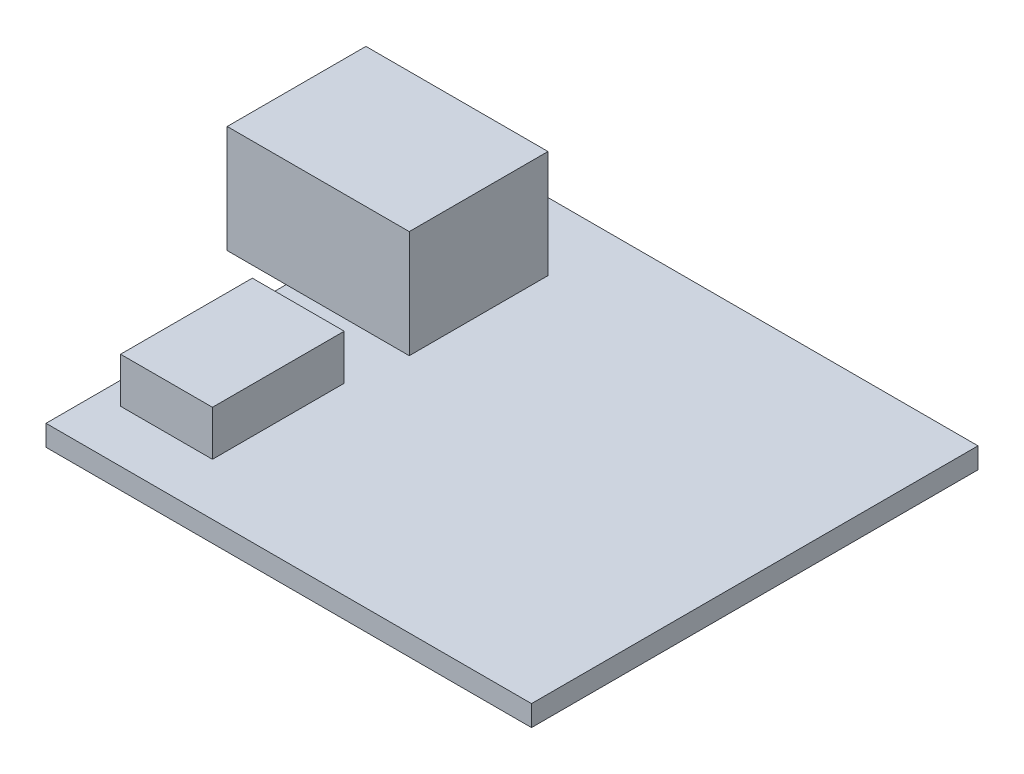
ISO-10303-21;
HEADER;
FILE_DESCRIPTION(('STEP AP214'),'2;1');
FILE_NAME('part.step','',(''),(''),'','','');
FILE_SCHEMA(('AUTOMOTIVE_DESIGN { 1 0 10303 214 1 1 1 1 }'));
ENDSEC;
DATA;
#1=APPLICATION_CONTEXT('core data for automotive mechanical design processes');
#2=APPLICATION_PROTOCOL_DEFINITION('international standard','automotive_design',2000,#1);
#3=PRODUCT_CONTEXT('',#1,'mechanical');
#4=PRODUCT('Part','Part','',(#3));
#5=PRODUCT_RELATED_PRODUCT_CATEGORY('part','',(#4));
#6=PRODUCT_DEFINITION_FORMATION('','',#4);
#7=PRODUCT_DEFINITION_CONTEXT('part definition',#1,'design');
#8=PRODUCT_DEFINITION('design','',#6,#7);
#9=PRODUCT_DEFINITION_SHAPE('','',#8);
#10=(LENGTH_UNIT() NAMED_UNIT(*) SI_UNIT(.MILLI.,.METRE.));
#11=(NAMED_UNIT(*) PLANE_ANGLE_UNIT() SI_UNIT($,.RADIAN.));
#12=(NAMED_UNIT(*) SI_UNIT($,.STERADIAN.) SOLID_ANGLE_UNIT());
#13=UNCERTAINTY_MEASURE_WITH_UNIT(LENGTH_MEASURE(1.E-05),#10,'distance_accuracy_value','');
#14=(GEOMETRIC_REPRESENTATION_CONTEXT(3) GLOBAL_UNCERTAINTY_ASSIGNED_CONTEXT((#13)) GLOBAL_UNIT_ASSIGNED_CONTEXT((#10,
#11,#12)) REPRESENTATION_CONTEXT('',''));
#15=CARTESIAN_POINT('',(0.,0.,0.));
#16=DIRECTION('',(0.,0.,1.));
#17=DIRECTION('',(1.,0.,0.));
#18=AXIS2_PLACEMENT_3D('',#15,#16,#17);
#19=CARTESIAN_POINT('',(0.,1.2,0.));
#20=DIRECTION('',(0.,-1.,0.));
#21=DIRECTION('',(0.,0.,-1.));
#22=AXIS2_PLACEMENT_3D('',#19,#20,#21);
#23=PLANE('',#22);
#24=DIRECTION('',(1.,0.,0.));
#25=VECTOR('',#24,1.);
#26=CARTESIAN_POINT('',(-6.9,1.2,-0.974999999999996));
#27=LINE('',#26,#25);
#28=CARTESIAN_POINT('',(-14.,1.2,-0.974999999999992));
#29=VERTEX_POINT('',#28);
#30=CARTESIAN_POINT('',(-6.9,1.2,-0.974999999999996));
#31=VERTEX_POINT('',#30);
#32=EDGE_CURVE('E11',#29,#31,#27,.T.);
#33=ORIENTED_EDGE('',*,*,#32,.F.);
#34=DIRECTION('',(0.,0.,1.));
#35=VECTOR('',#34,1.);
#36=CARTESIAN_POINT('',(-14.,1.2,12.875));
#37=LINE('',#36,#35);
#38=CARTESIAN_POINT('',(-14.,1.2,12.875));
#39=VERTEX_POINT('',#38);
#40=EDGE_CURVE('E194',#29,#39,#37,.T.);
#41=ORIENTED_EDGE('',*,*,#40,.T.);
#42=DIRECTION('',(1.,0.,0.));
#43=VECTOR('',#42,1.);
#44=CARTESIAN_POINT('',(-14.,1.2,12.875));
#45=LINE('',#44,#43);
#46=CARTESIAN_POINT('',(14.,1.2,12.875));
#47=VERTEX_POINT('',#46);
#48=EDGE_CURVE('E197',#39,#47,#45,.T.);
#49=ORIENTED_EDGE('',*,*,#48,.T.);
#50=DIRECTION('',(0.,0.,-1.));
#51=VECTOR('',#50,1.);
#52=CARTESIAN_POINT('',(14.,1.2,12.875));
#53=LINE('',#52,#51);
#54=CARTESIAN_POINT('',(14.,1.2,-12.875));
#55=VERTEX_POINT('',#54);
#56=EDGE_CURVE('E188',#47,#55,#53,.T.);
#57=ORIENTED_EDGE('',*,*,#56,.T.);
#58=DIRECTION('',(-1.,0.,0.));
#59=VECTOR('',#58,1.);
#60=CARTESIAN_POINT('',(-14.,1.2,-12.875));
#61=LINE('',#60,#59);
#62=CARTESIAN_POINT('',(-14.,1.2,-12.875));
#63=VERTEX_POINT('',#62);
#64=EDGE_CURVE('E191',#55,#63,#61,.T.);
#65=ORIENTED_EDGE('',*,*,#64,.T.);
#66=CARTESIAN_POINT('',(-14.,1.2,-8.97499999999999));
#67=VERTEX_POINT('',#66);
#68=EDGE_CURVE('E195',#63,#67,#37,.T.);
#69=ORIENTED_EDGE('',*,*,#68,.T.);
#70=DIRECTION('',(-1.,0.,0.));
#71=VECTOR('',#70,1.);
#72=CARTESIAN_POINT('',(-6.9,1.2,-8.975));
#73=LINE('',#72,#71);
#74=CARTESIAN_POINT('',(-6.9,1.2,-8.975));
#75=VERTEX_POINT('',#74);
#76=EDGE_CURVE('E170',#75,#67,#73,.T.);
#77=ORIENTED_EDGE('',*,*,#76,.F.);
#78=DIRECTION('',(0.,0.,-1.));
#79=VECTOR('',#78,1.);
#80=CARTESIAN_POINT('',(-6.9,1.2,-8.975));
#81=LINE('',#80,#79);
#82=EDGE_CURVE('E151',#31,#75,#81,.T.);
#83=ORIENTED_EDGE('',*,*,#82,.F.);
#84=EDGE_LOOP('',(#33,#41,#49,#57,#65,#69,#77,#83));
#85=FACE_BOUND('',#84,.T.);
#86=DIRECTION('',(0.,0.,-1.));
#87=VECTOR('',#86,1.);
#88=CARTESIAN_POINT('',(-7.4,1.2,2.275));
#89=LINE('',#88,#87);
#90=CARTESIAN_POINT('',(-7.4,1.2,9.875));
#91=VERTEX_POINT('',#90);
#92=CARTESIAN_POINT('',(-7.4,1.2,2.275));
#93=VERTEX_POINT('',#92);
#94=EDGE_CURVE('E150',#91,#93,#89,.T.);
#95=ORIENTED_EDGE('',*,*,#94,.F.);
#96=DIRECTION('',(1.,0.,0.));
#97=VECTOR('',#96,1.);
#98=CARTESIAN_POINT('',(-7.4,1.2,9.875));
#99=LINE('',#98,#97);
#100=CARTESIAN_POINT('',(-12.7,1.2,9.875));
#101=VERTEX_POINT('',#100);
#102=EDGE_CURVE('E147',#101,#91,#99,.T.);
#103=ORIENTED_EDGE('',*,*,#102,.F.);
#104=DIRECTION('',(0.,0.,1.));
#105=VECTOR('',#104,1.);
#106=CARTESIAN_POINT('',(-12.7,1.2,2.275));
#107=LINE('',#106,#105);
#108=CARTESIAN_POINT('',(-12.7,1.2,2.275));
#109=VERTEX_POINT('',#108);
#110=EDGE_CURVE('E55',#109,#101,#107,.T.);
#111=ORIENTED_EDGE('',*,*,#110,.F.);
#112=DIRECTION('',(-1.,0.,0.));
#113=VECTOR('',#112,1.);
#114=CARTESIAN_POINT('',(-7.4,1.2,2.275));
#115=LINE('',#114,#113);
#116=EDGE_CURVE('E50',#93,#109,#115,.T.);
#117=ORIENTED_EDGE('',*,*,#116,.F.);
#118=EDGE_LOOP('',(#95,#103,#111,#117));
#119=FACE_BOUND('',#118,.T.);
#120=ADVANCED_FACE('F33',(#85,#119),#23,.F.);
#121=CARTESIAN_POINT('',(14.,1.2,12.875));
#122=DIRECTION('',(-1.,0.,0.));
#123=DIRECTION('',(0.,0.,1.));
#124=AXIS2_PLACEMENT_3D('',#121,#122,#123);
#125=PLANE('',#124);
#126=DIRECTION('',(0.,0.,-1.));
#127=VECTOR('',#126,1.);
#128=CARTESIAN_POINT('',(14.,0.,12.875));
#129=LINE('',#128,#127);
#130=CARTESIAN_POINT('',(14.,0.,12.875));
#131=VERTEX_POINT('',#130);
#132=CARTESIAN_POINT('',(14.,0.,-12.875));
#133=VERTEX_POINT('',#132);
#134=EDGE_CURVE('E187',#131,#133,#129,.T.);
#135=ORIENTED_EDGE('',*,*,#134,.T.);
#136=DIRECTION('',(0.,-1.,0.));
#137=VECTOR('',#136,1.);
#138=CARTESIAN_POINT('',(14.,1.2,-12.875));
#139=LINE('',#138,#137);
#140=EDGE_CURVE('E37',#55,#133,#139,.T.);
#141=ORIENTED_EDGE('',*,*,#140,.F.);
#142=ORIENTED_EDGE('',*,*,#56,.F.);
#143=DIRECTION('',(0.,-1.,0.));
#144=VECTOR('',#143,1.);
#145=CARTESIAN_POINT('',(14.,1.2,12.875));
#146=LINE('',#145,#144);
#147=EDGE_CURVE('E200',#47,#131,#146,.T.);
#148=ORIENTED_EDGE('',*,*,#147,.T.);
#149=EDGE_LOOP('',(#135,#141,#142,#148));
#150=FACE_BOUND('',#149,.T.);
#151=ADVANCED_FACE('F35',(#150),#125,.F.);
#152=CARTESIAN_POINT('',(-14.,1.2,-12.875));
#153=DIRECTION('',(0.,0.,1.));
#154=DIRECTION('',(1.,0.,0.));
#155=AXIS2_PLACEMENT_3D('',#152,#153,#154);
#156=PLANE('',#155);
#157=DIRECTION('',(-1.,0.,0.));
#158=VECTOR('',#157,1.);
#159=CARTESIAN_POINT('',(-14.,0.,-12.875));
#160=LINE('',#159,#158);
#161=CARTESIAN_POINT('',(-14.,0.,-12.875));
#162=VERTEX_POINT('',#161);
#163=EDGE_CURVE('E203',#133,#162,#160,.T.);
#164=ORIENTED_EDGE('',*,*,#163,.T.);
#165=DIRECTION('',(0.,-1.,0.));
#166=VECTOR('',#165,1.);
#167=CARTESIAN_POINT('',(-14.,1.2,-12.875));
#168=LINE('',#167,#166);
#169=EDGE_CURVE('E212',#63,#162,#168,.T.);
#170=ORIENTED_EDGE('',*,*,#169,.F.);
#171=ORIENTED_EDGE('',*,*,#64,.F.);
#172=ORIENTED_EDGE('',*,*,#140,.T.);
#173=EDGE_LOOP('',(#164,#170,#171,#172));
#174=FACE_BOUND('',#173,.T.);
#175=ADVANCED_FACE('F221',(#174),#156,.F.);
#176=CARTESIAN_POINT('',(-14.,1.2,12.875));
#177=DIRECTION('',(1.,0.,0.));
#178=DIRECTION('',(0.,0.,-1.));
#179=AXIS2_PLACEMENT_3D('',#176,#177,#178);
#180=PLANE('',#179);
#181=DIRECTION('',(0.,0.,1.));
#182=VECTOR('',#181,1.);
#183=CARTESIAN_POINT('',(-14.,0.,12.875));
#184=LINE('',#183,#182);
#185=CARTESIAN_POINT('',(-14.,0.,12.875));
#186=VERTEX_POINT('',#185);
#187=EDGE_CURVE('E205',#162,#186,#184,.T.);
#188=ORIENTED_EDGE('',*,*,#187,.T.);
#189=DIRECTION('',(0.,-1.,0.));
#190=VECTOR('',#189,1.);
#191=CARTESIAN_POINT('',(-14.,1.2,12.875));
#192=LINE('',#191,#190);
#193=EDGE_CURVE('E210',#39,#186,#192,.T.);
#194=ORIENTED_EDGE('',*,*,#193,.F.);
#195=ORIENTED_EDGE('',*,*,#40,.F.);
#196=EDGE_CURVE('E198',#67,#29,#37,.T.);
#197=ORIENTED_EDGE('',*,*,#196,.F.);
#198=ORIENTED_EDGE('',*,*,#68,.F.);
#199=ORIENTED_EDGE('',*,*,#169,.T.);
#200=EDGE_LOOP('',(#188,#194,#195,#197,#198,#199));
#201=FACE_BOUND('',#200,.T.);
#202=ADVANCED_FACE('F230',(#201),#180,.F.);
#203=CARTESIAN_POINT('',(-14.,1.2,12.875));
#204=DIRECTION('',(0.,0.,-1.));
#205=DIRECTION('',(-1.,0.,0.));
#206=AXIS2_PLACEMENT_3D('',#203,#204,#205);
#207=PLANE('',#206);
#208=DIRECTION('',(1.,0.,0.));
#209=VECTOR('',#208,1.);
#210=CARTESIAN_POINT('',(-14.,0.,12.875));
#211=LINE('',#210,#209);
#212=EDGE_CURVE('E192',#186,#131,#211,.T.);
#213=ORIENTED_EDGE('',*,*,#212,.T.);
#214=ORIENTED_EDGE('',*,*,#147,.F.);
#215=ORIENTED_EDGE('',*,*,#48,.F.);
#216=ORIENTED_EDGE('',*,*,#193,.T.);
#217=EDGE_LOOP('',(#213,#214,#215,#216));
#218=FACE_BOUND('',#217,.T.);
#219=ADVANCED_FACE('F234',(#218),#207,.F.);
#220=CARTESIAN_POINT('',(0.,0.,0.));
#221=DIRECTION('',(0.,-1.,0.));
#222=DIRECTION('',(0.,0.,-1.));
#223=AXIS2_PLACEMENT_3D('',#220,#221,#222);
#224=PLANE('',#223);
#225=ORIENTED_EDGE('',*,*,#134,.F.);
#226=ORIENTED_EDGE('',*,*,#212,.F.);
#227=ORIENTED_EDGE('',*,*,#187,.F.);
#228=ORIENTED_EDGE('',*,*,#163,.F.);
#229=EDGE_LOOP('',(#225,#226,#227,#228));
#230=FACE_BOUND('',#229,.T.);
#231=ADVANCED_FACE('F228',(#230),#224,.T.);
#232=CARTESIAN_POINT('',(-6.9,7.4,-8.975));
#233=DIRECTION('',(-1.,0.,0.));
#234=DIRECTION('',(0.,0.,1.));
#235=AXIS2_PLACEMENT_3D('',#232,#233,#234);
#236=PLANE('',#235);
#237=ORIENTED_EDGE('',*,*,#82,.T.);
#238=DIRECTION('',(0.,-1.,0.));
#239=VECTOR('',#238,1.);
#240=CARTESIAN_POINT('',(-6.9,7.4,-8.975));
#241=LINE('',#240,#239);
#242=CARTESIAN_POINT('',(-6.9,7.4,-8.975));
#243=VERTEX_POINT('',#242);
#244=EDGE_CURVE('E184',#243,#75,#241,.T.);
#245=ORIENTED_EDGE('',*,*,#244,.F.);
#246=DIRECTION('',(0.,0.,-1.));
#247=VECTOR('',#246,1.);
#248=CARTESIAN_POINT('',(-6.9,7.4,-8.975));
#249=LINE('',#248,#247);
#250=CARTESIAN_POINT('',(-6.9,7.4,-0.974999999999996));
#251=VERTEX_POINT('',#250);
#252=EDGE_CURVE('E160',#251,#243,#249,.T.);
#253=ORIENTED_EDGE('',*,*,#252,.F.);
#254=DIRECTION('',(0.,-1.,0.));
#255=VECTOR('',#254,1.);
#256=CARTESIAN_POINT('',(-6.9,7.4,-0.974999999999996));
#257=LINE('',#256,#255);
#258=EDGE_CURVE('E168',#251,#31,#257,.T.);
#259=ORIENTED_EDGE('',*,*,#258,.T.);
#260=EDGE_LOOP('',(#237,#245,#253,#259));
#261=FACE_BOUND('',#260,.T.);
#262=ADVANCED_FACE('F256',(#261),#236,.F.);
#263=CARTESIAN_POINT('',(-6.9,7.4,-8.975));
#264=DIRECTION('',(0.,0.,1.));
#265=DIRECTION('',(1.,0.,0.));
#266=AXIS2_PLACEMENT_3D('',#263,#264,#265);
#267=PLANE('',#266);
#268=ORIENTED_EDGE('',*,*,#76,.T.);
#269=CARTESIAN_POINT('',(-17.4,1.2,-8.97499999999999));
#270=VERTEX_POINT('',#269);
#271=EDGE_CURVE('E154',#67,#270,#73,.T.);
#272=ORIENTED_EDGE('',*,*,#271,.T.);
#273=DIRECTION('',(0.,-1.,0.));
#274=VECTOR('',#273,1.);
#275=CARTESIAN_POINT('',(-17.4,7.4,-8.97499999999999));
#276=LINE('',#275,#274);
#277=CARTESIAN_POINT('',(-17.4,7.4,-8.97499999999999));
#278=VERTEX_POINT('',#277);
#279=EDGE_CURVE('E181',#278,#270,#276,.T.);
#280=ORIENTED_EDGE('',*,*,#279,.F.);
#281=DIRECTION('',(-1.,0.,0.));
#282=VECTOR('',#281,1.);
#283=CARTESIAN_POINT('',(-6.9,7.4,-8.975));
#284=LINE('',#283,#282);
#285=EDGE_CURVE('E163',#243,#278,#284,.T.);
#286=ORIENTED_EDGE('',*,*,#285,.F.);
#287=ORIENTED_EDGE('',*,*,#244,.T.);
#288=EDGE_LOOP('',(#268,#272,#280,#286,#287));
#289=FACE_BOUND('',#288,.T.);
#290=ADVANCED_FACE('F253',(#289),#267,.F.);
#291=CARTESIAN_POINT('',(-17.4,7.4,-8.97499999999999));
#292=DIRECTION('',(1.,0.,0.));
#293=DIRECTION('',(0.,0.,-1.));
#294=AXIS2_PLACEMENT_3D('',#291,#292,#293);
#295=PLANE('',#294);
#296=DIRECTION('',(0.,0.,1.));
#297=VECTOR('',#296,1.);
#298=CARTESIAN_POINT('',(-17.4,1.2,-8.97499999999999));
#299=LINE('',#298,#297);
#300=CARTESIAN_POINT('',(-17.4,1.2,-0.974999999999995));
#301=VERTEX_POINT('',#300);
#302=EDGE_CURVE('E173',#270,#301,#299,.T.);
#303=ORIENTED_EDGE('',*,*,#302,.T.);
#304=DIRECTION('',(0.,-1.,0.));
#305=VECTOR('',#304,1.);
#306=CARTESIAN_POINT('',(-17.4,7.4,-0.974999999999995));
#307=LINE('',#306,#305);
#308=CARTESIAN_POINT('',(-17.4,7.4,-0.974999999999995));
#309=VERTEX_POINT('',#308);
#310=EDGE_CURVE('E178',#309,#301,#307,.T.);
#311=ORIENTED_EDGE('',*,*,#310,.F.);
#312=DIRECTION('',(0.,0.,1.));
#313=VECTOR('',#312,1.);
#314=CARTESIAN_POINT('',(-17.4,7.4,-8.97499999999999));
#315=LINE('',#314,#313);
#316=EDGE_CURVE('E165',#278,#309,#315,.T.);
#317=ORIENTED_EDGE('',*,*,#316,.F.);
#318=ORIENTED_EDGE('',*,*,#279,.T.);
#319=EDGE_LOOP('',(#303,#311,#317,#318));
#320=FACE_BOUND('',#319,.T.);
#321=ADVANCED_FACE('F250',(#320),#295,.F.);
#322=CARTESIAN_POINT('',(-6.9,7.4,-0.974999999999996));
#323=DIRECTION('',(0.,0.,-1.));
#324=DIRECTION('',(-1.,0.,0.));
#325=AXIS2_PLACEMENT_3D('',#322,#323,#324);
#326=PLANE('',#325);
#327=EDGE_CURVE('E43',#301,#29,#27,.T.);
#328=ORIENTED_EDGE('',*,*,#327,.T.);
#329=ORIENTED_EDGE('',*,*,#32,.T.);
#330=ORIENTED_EDGE('',*,*,#258,.F.);
#331=DIRECTION('',(1.,0.,0.));
#332=VECTOR('',#331,1.);
#333=CARTESIAN_POINT('',(-6.9,7.4,-0.974999999999996));
#334=LINE('',#333,#332);
#335=EDGE_CURVE('E167',#309,#251,#334,.T.);
#336=ORIENTED_EDGE('',*,*,#335,.F.);
#337=ORIENTED_EDGE('',*,*,#310,.T.);
#338=EDGE_LOOP('',(#328,#329,#330,#336,#337));
#339=FACE_BOUND('',#338,.T.);
#340=ADVANCED_FACE('F244',(#339),#326,.F.);
#341=CARTESIAN_POINT('',(0.,7.4,0.));
#342=DIRECTION('',(0.,-1.,0.));
#343=DIRECTION('',(0.,0.,-1.));
#344=AXIS2_PLACEMENT_3D('',#341,#342,#343);
#345=PLANE('',#344);
#346=ORIENTED_EDGE('',*,*,#252,.T.);
#347=ORIENTED_EDGE('',*,*,#285,.T.);
#348=ORIENTED_EDGE('',*,*,#316,.T.);
#349=ORIENTED_EDGE('',*,*,#335,.T.);
#350=EDGE_LOOP('',(#346,#347,#348,#349));
#351=FACE_BOUND('',#350,.T.);
#352=ADVANCED_FACE('F259',(#351),#345,.F.);
#353=CARTESIAN_POINT('',(0.,1.2,0.));
#354=DIRECTION('',(0.,-1.,0.));
#355=DIRECTION('',(0.,0.,-1.));
#356=AXIS2_PLACEMENT_3D('',#353,#354,#355);
#357=PLANE('',#356);
#358=ORIENTED_EDGE('',*,*,#271,.F.);
#359=ORIENTED_EDGE('',*,*,#196,.T.);
#360=ORIENTED_EDGE('',*,*,#327,.F.);
#361=ORIENTED_EDGE('',*,*,#302,.F.);
#362=EDGE_LOOP('',(#358,#359,#360,#361));
#363=FACE_BOUND('',#362,.T.);
#364=ADVANCED_FACE('F241',(#363),#357,.T.);
#365=CARTESIAN_POINT('',(-7.4,3.8,2.275));
#366=DIRECTION('',(-1.,0.,0.));
#367=DIRECTION('',(0.,0.,1.));
#368=AXIS2_PLACEMENT_3D('',#365,#366,#367);
#369=PLANE('',#368);
#370=ORIENTED_EDGE('',*,*,#94,.T.);
#371=DIRECTION('',(0.,-1.,0.));
#372=VECTOR('',#371,1.);
#373=CARTESIAN_POINT('',(-7.4,3.8,2.275));
#374=LINE('',#373,#372);
#375=CARTESIAN_POINT('',(-7.4,3.8,2.275));
#376=VERTEX_POINT('',#375);
#377=EDGE_CURVE('E131',#376,#93,#374,.T.);
#378=ORIENTED_EDGE('',*,*,#377,.F.);
#379=DIRECTION('',(0.,0.,-1.));
#380=VECTOR('',#379,1.);
#381=CARTESIAN_POINT('',(-7.4,3.8,2.275));
#382=LINE('',#381,#380);
#383=CARTESIAN_POINT('',(-7.4,3.8,9.875));
#384=VERTEX_POINT('',#383);
#385=EDGE_CURVE('E138',#384,#376,#382,.T.);
#386=ORIENTED_EDGE('',*,*,#385,.F.);
#387=DIRECTION('',(0.,-1.,0.));
#388=VECTOR('',#387,1.);
#389=CARTESIAN_POINT('',(-7.4,3.8,9.875));
#390=LINE('',#389,#388);
#391=EDGE_CURVE('E382',#384,#91,#390,.T.);
#392=ORIENTED_EDGE('',*,*,#391,.T.);
#393=EDGE_LOOP('',(#370,#378,#386,#392));
#394=FACE_BOUND('',#393,.T.);
#395=ADVANCED_FACE('F149',(#394),#369,.F.);
#396=CARTESIAN_POINT('',(-7.4,3.8,2.275));
#397=DIRECTION('',(0.,0.,1.));
#398=DIRECTION('',(1.,0.,0.));
#399=AXIS2_PLACEMENT_3D('',#396,#397,#398);
#400=PLANE('',#399);
#401=ORIENTED_EDGE('',*,*,#116,.T.);
#402=DIRECTION('',(0.,-1.,0.));
#403=VECTOR('',#402,1.);
#404=CARTESIAN_POINT('',(-12.7,3.8,2.275));
#405=LINE('',#404,#403);
#406=CARTESIAN_POINT('',(-12.7,3.8,2.275));
#407=VERTEX_POINT('',#406);
#408=EDGE_CURVE('E134',#407,#109,#405,.T.);
#409=ORIENTED_EDGE('',*,*,#408,.F.);
#410=DIRECTION('',(-1.,0.,0.));
#411=VECTOR('',#410,1.);
#412=CARTESIAN_POINT('',(-7.4,3.8,2.275));
#413=LINE('',#412,#411);
#414=EDGE_CURVE('E127',#376,#407,#413,.T.);
#415=ORIENTED_EDGE('',*,*,#414,.F.);
#416=ORIENTED_EDGE('',*,*,#377,.T.);
#417=EDGE_LOOP('',(#401,#409,#415,#416));
#418=FACE_BOUND('',#417,.T.);
#419=ADVANCED_FACE('F129',(#418),#400,.F.);
#420=CARTESIAN_POINT('',(-12.7,3.8,2.275));
#421=DIRECTION('',(1.,0.,0.));
#422=DIRECTION('',(0.,0.,-1.));
#423=AXIS2_PLACEMENT_3D('',#420,#421,#422);
#424=PLANE('',#423);
#425=ORIENTED_EDGE('',*,*,#110,.T.);
#426=DIRECTION('',(0.,-1.,0.));
#427=VECTOR('',#426,1.);
#428=CARTESIAN_POINT('',(-12.7,3.8,9.875));
#429=LINE('',#428,#427);
#430=CARTESIAN_POINT('',(-12.7,3.8,9.875));
#431=VERTEX_POINT('',#430);
#432=EDGE_CURVE('E156',#431,#101,#429,.T.);
#433=ORIENTED_EDGE('',*,*,#432,.F.);
#434=DIRECTION('',(0.,0.,1.));
#435=VECTOR('',#434,1.);
#436=CARTESIAN_POINT('',(-12.7,3.8,2.275));
#437=LINE('',#436,#435);
#438=EDGE_CURVE('E137',#407,#431,#437,.T.);
#439=ORIENTED_EDGE('',*,*,#438,.F.);
#440=ORIENTED_EDGE('',*,*,#408,.T.);
#441=EDGE_LOOP('',(#425,#433,#439,#440));
#442=FACE_BOUND('',#441,.T.);
#443=ADVANCED_FACE('F349',(#442),#424,.F.);
#444=CARTESIAN_POINT('',(-7.4,3.8,9.875));
#445=DIRECTION('',(0.,0.,-1.));
#446=DIRECTION('',(-1.,0.,0.));
#447=AXIS2_PLACEMENT_3D('',#444,#445,#446);
#448=PLANE('',#447);
#449=ORIENTED_EDGE('',*,*,#102,.T.);
#450=ORIENTED_EDGE('',*,*,#391,.F.);
#451=DIRECTION('',(1.,0.,0.));
#452=VECTOR('',#451,1.);
#453=CARTESIAN_POINT('',(-7.4,3.8,9.875));
#454=LINE('',#453,#452);
#455=EDGE_CURVE('E143',#431,#384,#454,.T.);
#456=ORIENTED_EDGE('',*,*,#455,.F.);
#457=ORIENTED_EDGE('',*,*,#432,.T.);
#458=EDGE_LOOP('',(#449,#450,#456,#457));
#459=FACE_BOUND('',#458,.T.);
#460=ADVANCED_FACE('F358',(#459),#448,.F.);
#461=CARTESIAN_POINT('',(0.,3.8,0.));
#462=DIRECTION('',(0.,-1.,0.));
#463=DIRECTION('',(0.,0.,-1.));
#464=AXIS2_PLACEMENT_3D('',#461,#462,#463);
#465=PLANE('',#464);
#466=ORIENTED_EDGE('',*,*,#385,.T.);
#467=ORIENTED_EDGE('',*,*,#414,.T.);
#468=ORIENTED_EDGE('',*,*,#438,.T.);
#469=ORIENTED_EDGE('',*,*,#455,.T.);
#470=EDGE_LOOP('',(#466,#467,#468,#469));
#471=FACE_BOUND('',#470,.T.);
#472=ADVANCED_FACE('F141',(#471),#465,.F.);
#473=CLOSED_SHELL('',(#120,#151,#175,#202,#219,#231,#262,#290,#321,#340,#352,#364,#395,#419,
#443,#460,#472));
#474=MANIFOLD_SOLID_BREP('B2',#473);
#475=ADVANCED_BREP_SHAPE_REPRESENTATION('',(#18,#474),#14);
#476=SHAPE_DEFINITION_REPRESENTATION(#9,#475);
ENDSEC;
END-ISO-10303-21;
